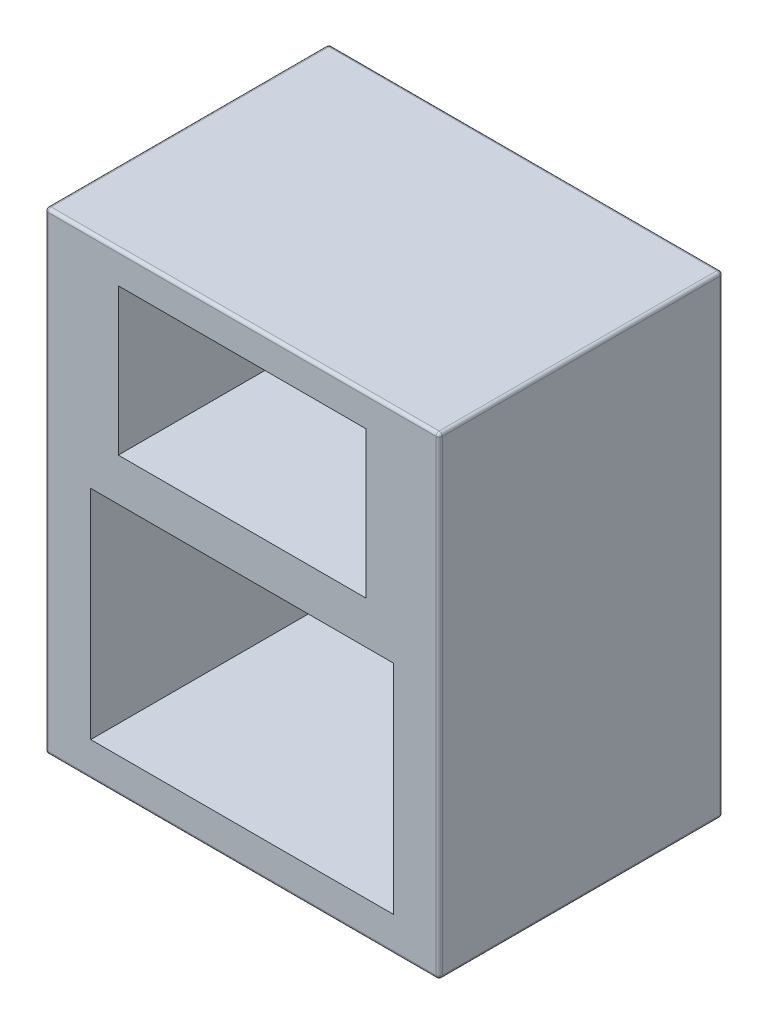
ISO-10303-21;
HEADER;
FILE_DESCRIPTION(('STEP AP214'),'2;1');
FILE_NAME('part.step','',(''),(''),'','','');
FILE_SCHEMA(('AUTOMOTIVE_DESIGN { 1 0 10303 214 1 1 1 1 }'));
ENDSEC;
DATA;
#1=APPLICATION_CONTEXT('core data for automotive mechanical design processes');
#2=APPLICATION_PROTOCOL_DEFINITION('international standard','automotive_design',2000,#1);
#3=PRODUCT_CONTEXT('',#1,'mechanical');
#4=PRODUCT('Part','Part','',(#3));
#5=PRODUCT_RELATED_PRODUCT_CATEGORY('part','',(#4));
#6=PRODUCT_DEFINITION_FORMATION('','',#4);
#7=PRODUCT_DEFINITION_CONTEXT('part definition',#1,'design');
#8=PRODUCT_DEFINITION('design','',#6,#7);
#9=PRODUCT_DEFINITION_SHAPE('','',#8);
#10=(LENGTH_UNIT() NAMED_UNIT(*) SI_UNIT(.MILLI.,.METRE.));
#11=(NAMED_UNIT(*) PLANE_ANGLE_UNIT() SI_UNIT($,.RADIAN.));
#12=(NAMED_UNIT(*) SI_UNIT($,.STERADIAN.) SOLID_ANGLE_UNIT());
#13=UNCERTAINTY_MEASURE_WITH_UNIT(LENGTH_MEASURE(1.E-05),#10,'distance_accuracy_value','');
#14=(GEOMETRIC_REPRESENTATION_CONTEXT(3) GLOBAL_UNCERTAINTY_ASSIGNED_CONTEXT((#13)) GLOBAL_UNIT_ASSIGNED_CONTEXT((#10,
#11,#12)) REPRESENTATION_CONTEXT('',''));
#15=CARTESIAN_POINT('',(0.,0.,0.));
#16=DIRECTION('',(0.,0.,1.));
#17=DIRECTION('',(1.,0.,0.));
#18=AXIS2_PLACEMENT_3D('',#15,#16,#17);
#19=CARTESIAN_POINT('',(0.,0.,180.));
#20=DIRECTION('',(1.,0.,0.));
#21=DIRECTION('',(0.,0.,-1.));
#22=AXIS2_PLACEMENT_3D('',#19,#20,#21);
#23=PLANE('',#22);
#24=DIRECTION('',(0.,-1.,0.));
#25=VECTOR('',#24,1.);
#26=CARTESIAN_POINT('',(0.,0.,2.));
#27=LINE('',#26,#25);
#28=CARTESIAN_POINT('',(0.,298.,2.));
#29=VERTEX_POINT('',#28);
#30=CARTESIAN_POINT('',(0.,2.,2.));
#31=VERTEX_POINT('',#30);
#32=EDGE_CURVE('E255',#29,#31,#27,.T.);
#33=ORIENTED_EDGE('',*,*,#32,.T.);
#34=DIRECTION('',(0.,0.,-1.));
#35=VECTOR('',#34,1.);
#36=CARTESIAN_POINT('',(0.,2.,180.));
#37=LINE('',#36,#35);
#38=CARTESIAN_POINT('',(0.,2.,178.));
#39=VERTEX_POINT('',#38);
#40=EDGE_CURVE('E257',#31,#39,#37,.F.);
#41=ORIENTED_EDGE('',*,*,#40,.T.);
#42=DIRECTION('',(0.,-1.,0.));
#43=VECTOR('',#42,1.);
#44=CARTESIAN_POINT('',(0.,0.,178.));
#45=LINE('',#44,#43);
#46=CARTESIAN_POINT('',(0.,298.,178.));
#47=VERTEX_POINT('',#46);
#48=EDGE_CURVE('E251',#39,#47,#45,.F.);
#49=ORIENTED_EDGE('',*,*,#48,.T.);
#50=DIRECTION('',(0.,0.,-1.));
#51=VECTOR('',#50,1.);
#52=CARTESIAN_POINT('',(0.,298.,180.));
#53=LINE('',#52,#51);
#54=EDGE_CURVE('E253',#47,#29,#53,.T.);
#55=ORIENTED_EDGE('',*,*,#54,.T.);
#56=EDGE_LOOP('',(#33,#41,#49,#55));
#57=FACE_BOUND('',#56,.T.);
#58=ADVANCED_FACE('F36',(#57),#23,.F.);
#59=CARTESIAN_POINT('',(0.,0.,180.));
#60=DIRECTION('',(0.,1.,0.));
#61=DIRECTION('',(0.,0.,1.));
#62=AXIS2_PLACEMENT_3D('',#59,#60,#61);
#63=PLANE('',#62);
#64=DIRECTION('',(1.,0.,0.));
#65=VECTOR('',#64,1.);
#66=CARTESIAN_POINT('',(0.,0.,178.));
#67=LINE('',#66,#65);
#68=CARTESIAN_POINT('',(248.,0.,178.));
#69=VERTEX_POINT('',#68);
#70=CARTESIAN_POINT('',(2.,0.,178.));
#71=VERTEX_POINT('',#70);
#72=EDGE_CURVE('E242',#69,#71,#67,.F.);
#73=ORIENTED_EDGE('',*,*,#72,.T.);
#74=DIRECTION('',(0.,0.,-1.));
#75=VECTOR('',#74,1.);
#76=CARTESIAN_POINT('',(2.,0.,180.));
#77=LINE('',#76,#75);
#78=CARTESIAN_POINT('',(2.,0.,2.));
#79=VERTEX_POINT('',#78);
#80=EDGE_CURVE('E248',#71,#79,#77,.T.);
#81=ORIENTED_EDGE('',*,*,#80,.T.);
#82=DIRECTION('',(1.,0.,0.));
#83=VECTOR('',#82,1.);
#84=CARTESIAN_POINT('',(250.,0.,2.));
#85=LINE('',#84,#83);
#86=CARTESIAN_POINT('',(248.,0.,2.));
#87=VERTEX_POINT('',#86);
#88=EDGE_CURVE('E246',#79,#87,#85,.T.);
#89=ORIENTED_EDGE('',*,*,#88,.T.);
#90=DIRECTION('',(0.,0.,-1.));
#91=VECTOR('',#90,1.);
#92=CARTESIAN_POINT('',(248.,0.,180.));
#93=LINE('',#92,#91);
#94=EDGE_CURVE('E244',#87,#69,#93,.F.);
#95=ORIENTED_EDGE('',*,*,#94,.T.);
#96=EDGE_LOOP('',(#73,#81,#89,#95));
#97=FACE_BOUND('',#96,.T.);
#98=ADVANCED_FACE('F445',(#97),#63,.F.);
#99=CARTESIAN_POINT('',(250.,0.,180.));
#100=DIRECTION('',(-1.,0.,0.));
#101=DIRECTION('',(0.,0.,1.));
#102=AXIS2_PLACEMENT_3D('',#99,#100,#101);
#103=PLANE('',#102);
#104=DIRECTION('',(0.,1.,0.));
#105=VECTOR('',#104,1.);
#106=CARTESIAN_POINT('',(250.,0.,178.));
#107=LINE('',#106,#105);
#108=CARTESIAN_POINT('',(250.,298.,178.));
#109=VERTEX_POINT('',#108);
#110=CARTESIAN_POINT('',(250.,2.,178.));
#111=VERTEX_POINT('',#110);
#112=EDGE_CURVE('E269',#109,#111,#107,.F.);
#113=ORIENTED_EDGE('',*,*,#112,.T.);
#114=DIRECTION('',(0.,0.,-1.));
#115=VECTOR('',#114,1.);
#116=CARTESIAN_POINT('',(250.,2.,180.));
#117=LINE('',#116,#115);
#118=CARTESIAN_POINT('',(250.,2.,2.));
#119=VERTEX_POINT('',#118);
#120=EDGE_CURVE('E275',#111,#119,#117,.T.);
#121=ORIENTED_EDGE('',*,*,#120,.T.);
#122=DIRECTION('',(0.,1.,0.));
#123=VECTOR('',#122,1.);
#124=CARTESIAN_POINT('',(250.,300.,2.));
#125=LINE('',#124,#123);
#126=CARTESIAN_POINT('',(250.,298.,2.));
#127=VERTEX_POINT('',#126);
#128=EDGE_CURVE('E273',#119,#127,#125,.T.);
#129=ORIENTED_EDGE('',*,*,#128,.T.);
#130=DIRECTION('',(0.,0.,-1.));
#131=VECTOR('',#130,1.);
#132=CARTESIAN_POINT('',(250.,298.,180.));
#133=LINE('',#132,#131);
#134=EDGE_CURVE('E271',#127,#109,#133,.F.);
#135=ORIENTED_EDGE('',*,*,#134,.T.);
#136=EDGE_LOOP('',(#113,#121,#129,#135));
#137=FACE_BOUND('',#136,.T.);
#138=ADVANCED_FACE('F383',(#137),#103,.F.);
#139=CARTESIAN_POINT('',(0.,300.,180.));
#140=DIRECTION('',(0.,-1.,0.));
#141=DIRECTION('',(0.,0.,-1.));
#142=AXIS2_PLACEMENT_3D('',#139,#140,#141);
#143=PLANE('',#142);
#144=DIRECTION('',(0.,0.,-1.));
#145=VECTOR('',#144,1.);
#146=CARTESIAN_POINT('',(248.,300.,180.));
#147=LINE('',#146,#145);
#148=CARTESIAN_POINT('',(248.,300.,178.));
#149=VERTEX_POINT('',#148);
#150=CARTESIAN_POINT('',(248.,300.,2.));
#151=VERTEX_POINT('',#150);
#152=EDGE_CURVE('E282',#149,#151,#147,.T.);
#153=ORIENTED_EDGE('',*,*,#152,.T.);
#154=DIRECTION('',(-1.,0.,0.));
#155=VECTOR('',#154,1.);
#156=CARTESIAN_POINT('',(0.,300.,2.));
#157=LINE('',#156,#155);
#158=CARTESIAN_POINT('',(2.,300.,2.));
#159=VERTEX_POINT('',#158);
#160=EDGE_CURVE('E285',#151,#159,#157,.T.);
#161=ORIENTED_EDGE('',*,*,#160,.T.);
#162=DIRECTION('',(0.,0.,-1.));
#163=VECTOR('',#162,1.);
#164=CARTESIAN_POINT('',(2.,300.,180.));
#165=LINE('',#164,#163);
#166=CARTESIAN_POINT('',(2.,300.,178.));
#167=VERTEX_POINT('',#166);
#168=EDGE_CURVE('E280',#159,#167,#165,.F.);
#169=ORIENTED_EDGE('',*,*,#168,.T.);
#170=DIRECTION('',(-1.,0.,0.));
#171=VECTOR('',#170,1.);
#172=CARTESIAN_POINT('',(0.,300.,178.));
#173=LINE('',#172,#171);
#174=EDGE_CURVE('E278',#167,#149,#173,.F.);
#175=ORIENTED_EDGE('',*,*,#174,.T.);
#176=EDGE_LOOP('',(#153,#161,#169,#175));
#177=FACE_BOUND('',#176,.T.);
#178=ADVANCED_FACE('F398',(#177),#143,.F.);
#179=CARTESIAN_POINT('',(0.,0.,180.));
#180=DIRECTION('',(0.,0.,-1.));
#181=DIRECTION('',(-1.,0.,0.));
#182=AXIS2_PLACEMENT_3D('',#179,#180,#181);
#183=PLANE('',#182);
#184=DIRECTION('',(0.,-1.,0.));
#185=VECTOR('',#184,1.);
#186=CARTESIAN_POINT('',(29.,160.,180.));
#187=LINE('',#186,#185);
#188=CARTESIAN_POINT('',(29.,160.,180.));
#189=VERTEX_POINT('',#188);
#190=CARTESIAN_POINT('',(29.,21.9999999999999,180.));
#191=VERTEX_POINT('',#190);
#192=EDGE_CURVE('E194',#189,#191,#187,.T.);
#193=ORIENTED_EDGE('',*,*,#192,.F.);
#194=DIRECTION('',(-1.,0.,0.));
#195=VECTOR('',#194,1.);
#196=CARTESIAN_POINT('',(29.,160.,180.));
#197=LINE('',#196,#195);
#198=CARTESIAN_POINT('',(221.,160.,180.));
#199=VERTEX_POINT('',#198);
#200=EDGE_CURVE('E53',#199,#189,#197,.T.);
#201=ORIENTED_EDGE('',*,*,#200,.F.);
#202=DIRECTION('',(0.,1.,0.));
#203=VECTOR('',#202,1.);
#204=CARTESIAN_POINT('',(221.,160.,180.));
#205=LINE('',#204,#203);
#206=CARTESIAN_POINT('',(221.,21.9999999999999,180.));
#207=VERTEX_POINT('',#206);
#208=EDGE_CURVE('E187',#207,#199,#205,.T.);
#209=ORIENTED_EDGE('',*,*,#208,.F.);
#210=DIRECTION('',(1.,0.,0.));
#211=VECTOR('',#210,1.);
#212=CARTESIAN_POINT('',(29.,21.9999999999999,180.));
#213=LINE('',#212,#211);
#214=EDGE_CURVE('E201',#191,#207,#213,.T.);
#215=ORIENTED_EDGE('',*,*,#214,.F.);
#216=EDGE_LOOP('',(#193,#201,#209,#215));
#217=FACE_BOUND('',#216,.T.);
#218=DIRECTION('',(0.,-1.,0.));
#219=VECTOR('',#218,1.);
#220=CARTESIAN_POINT('',(46.5,280.,180.));
#221=LINE('',#220,#219);
#222=CARTESIAN_POINT('',(46.5,280.,180.));
#223=VERTEX_POINT('',#222);
#224=CARTESIAN_POINT('',(46.5,187.,180.));
#225=VERTEX_POINT('',#224);
#226=EDGE_CURVE('E220',#223,#225,#221,.T.);
#227=ORIENTED_EDGE('',*,*,#226,.F.);
#228=DIRECTION('',(-1.,0.,0.));
#229=VECTOR('',#228,1.);
#230=CARTESIAN_POINT('',(46.5,280.,180.));
#231=LINE('',#230,#229);
#232=CARTESIAN_POINT('',(203.5,280.,180.));
#233=VERTEX_POINT('',#232);
#234=EDGE_CURVE('E218',#233,#223,#231,.T.);
#235=ORIENTED_EDGE('',*,*,#234,.F.);
#236=DIRECTION('',(0.,1.,0.));
#237=VECTOR('',#236,1.);
#238=CARTESIAN_POINT('',(203.5,280.,180.));
#239=LINE('',#238,#237);
#240=CARTESIAN_POINT('',(203.5,187.,180.));
#241=VERTEX_POINT('',#240);
#242=EDGE_CURVE('E226',#241,#233,#239,.T.);
#243=ORIENTED_EDGE('',*,*,#242,.F.);
#244=DIRECTION('',(1.,0.,0.));
#245=VECTOR('',#244,1.);
#246=CARTESIAN_POINT('',(46.5,187.,180.));
#247=LINE('',#246,#245);
#248=EDGE_CURVE('E223',#225,#241,#247,.T.);
#249=ORIENTED_EDGE('',*,*,#248,.F.);
#250=EDGE_LOOP('',(#227,#235,#243,#249));
#251=FACE_BOUND('',#250,.T.);
#252=DIRECTION('',(0.,1.,0.));
#253=VECTOR('',#252,1.);
#254=CARTESIAN_POINT('',(248.,0.,180.));
#255=LINE('',#254,#253);
#256=CARTESIAN_POINT('',(248.,2.,180.));
#257=VERTEX_POINT('',#256);
#258=CARTESIAN_POINT('',(248.,298.,180.));
#259=VERTEX_POINT('',#258);
#260=EDGE_CURVE('E45',#257,#259,#255,.T.);
#261=ORIENTED_EDGE('',*,*,#260,.T.);
#262=DIRECTION('',(-1.,0.,0.));
#263=VECTOR('',#262,1.);
#264=CARTESIAN_POINT('',(0.,298.,180.));
#265=LINE('',#264,#263);
#266=CARTESIAN_POINT('',(2.,298.,180.));
#267=VERTEX_POINT('',#266);
#268=EDGE_CURVE('E11',#259,#267,#265,.T.);
#269=ORIENTED_EDGE('',*,*,#268,.T.);
#270=DIRECTION('',(0.,-1.,0.));
#271=VECTOR('',#270,1.);
#272=CARTESIAN_POINT('',(2.,0.,180.));
#273=LINE('',#272,#271);
#274=CARTESIAN_POINT('',(2.,2.,180.));
#275=VERTEX_POINT('',#274);
#276=EDGE_CURVE('E287',#267,#275,#273,.T.);
#277=ORIENTED_EDGE('',*,*,#276,.T.);
#278=DIRECTION('',(1.,0.,0.));
#279=VECTOR('',#278,1.);
#280=CARTESIAN_POINT('',(0.,2.,180.));
#281=LINE('',#280,#279);
#282=EDGE_CURVE('E289',#275,#257,#281,.T.);
#283=ORIENTED_EDGE('',*,*,#282,.T.);
#284=EDGE_LOOP('',(#261,#269,#277,#283));
#285=FACE_BOUND('',#284,.T.);
#286=ADVANCED_FACE('F375',(#217,#251,#285),#183,.F.);
#287=CARTESIAN_POINT('',(0.,0.,0.));
#288=DIRECTION('',(0.,0.,-1.));
#289=DIRECTION('',(-1.,0.,0.));
#290=AXIS2_PLACEMENT_3D('',#287,#288,#289);
#291=PLANE('',#290);
#292=DIRECTION('',(-1.,0.,0.));
#293=VECTOR('',#292,1.);
#294=CARTESIAN_POINT('',(29.,160.,0.));
#295=LINE('',#294,#293);
#296=CARTESIAN_POINT('',(221.,160.,0.));
#297=VERTEX_POINT('',#296);
#298=CARTESIAN_POINT('',(29.,160.,0.));
#299=VERTEX_POINT('',#298);
#300=EDGE_CURVE('E185',#297,#299,#295,.T.);
#301=ORIENTED_EDGE('',*,*,#300,.T.);
#302=DIRECTION('',(0.,-1.,0.));
#303=VECTOR('',#302,1.);
#304=CARTESIAN_POINT('',(29.,160.,0.));
#305=LINE('',#304,#303);
#306=CARTESIAN_POINT('',(29.,21.9999999999999,0.));
#307=VERTEX_POINT('',#306);
#308=EDGE_CURVE('E174',#299,#307,#305,.T.);
#309=ORIENTED_EDGE('',*,*,#308,.T.);
#310=DIRECTION('',(1.,0.,0.));
#311=VECTOR('',#310,1.);
#312=CARTESIAN_POINT('',(29.,21.9999999999999,0.));
#313=LINE('',#312,#311);
#314=CARTESIAN_POINT('',(221.,21.9999999999999,0.));
#315=VERTEX_POINT('',#314);
#316=EDGE_CURVE('E196',#307,#315,#313,.T.);
#317=ORIENTED_EDGE('',*,*,#316,.T.);
#318=DIRECTION('',(0.,1.,0.));
#319=VECTOR('',#318,1.);
#320=CARTESIAN_POINT('',(221.,160.,0.));
#321=LINE('',#320,#319);
#322=EDGE_CURVE('E192',#315,#297,#321,.T.);
#323=ORIENTED_EDGE('',*,*,#322,.T.);
#324=EDGE_LOOP('',(#301,#309,#317,#323));
#325=FACE_BOUND('',#324,.T.);
#326=DIRECTION('',(-1.,0.,0.));
#327=VECTOR('',#326,1.);
#328=CARTESIAN_POINT('',(46.5,280.,0.));
#329=LINE('',#328,#327);
#330=CARTESIAN_POINT('',(203.5,280.,0.));
#331=VERTEX_POINT('',#330);
#332=CARTESIAN_POINT('',(46.5,280.,0.));
#333=VERTEX_POINT('',#332);
#334=EDGE_CURVE('E215',#331,#333,#329,.T.);
#335=ORIENTED_EDGE('',*,*,#334,.T.);
#336=DIRECTION('',(0.,-1.,0.));
#337=VECTOR('',#336,1.);
#338=CARTESIAN_POINT('',(46.5,280.,0.));
#339=LINE('',#338,#337);
#340=CARTESIAN_POINT('',(46.5,187.,0.));
#341=VERTEX_POINT('',#340);
#342=EDGE_CURVE('E232',#333,#341,#339,.T.);
#343=ORIENTED_EDGE('',*,*,#342,.T.);
#344=DIRECTION('',(1.,0.,0.));
#345=VECTOR('',#344,1.);
#346=CARTESIAN_POINT('',(46.5,187.,0.));
#347=LINE('',#346,#345);
#348=CARTESIAN_POINT('',(203.5,187.,0.));
#349=VERTEX_POINT('',#348);
#350=EDGE_CURVE('E181',#341,#349,#347,.T.);
#351=ORIENTED_EDGE('',*,*,#350,.T.);
#352=DIRECTION('',(0.,1.,0.));
#353=VECTOR('',#352,1.);
#354=CARTESIAN_POINT('',(203.5,280.,0.));
#355=LINE('',#354,#353);
#356=EDGE_CURVE('E212',#349,#331,#355,.T.);
#357=ORIENTED_EDGE('',*,*,#356,.T.);
#358=EDGE_LOOP('',(#335,#343,#351,#357));
#359=FACE_BOUND('',#358,.T.);
#360=DIRECTION('',(0.,1.,0.));
#361=VECTOR('',#360,1.);
#362=CARTESIAN_POINT('',(248.,0.,0.));
#363=LINE('',#362,#361);
#364=CARTESIAN_POINT('',(248.,298.,0.));
#365=VERTEX_POINT('',#364);
#366=CARTESIAN_POINT('',(248.,2.,0.));
#367=VERTEX_POINT('',#366);
#368=EDGE_CURVE('E262',#365,#367,#363,.F.);
#369=ORIENTED_EDGE('',*,*,#368,.T.);
#370=DIRECTION('',(1.,0.,0.));
#371=VECTOR('',#370,1.);
#372=CARTESIAN_POINT('',(0.,2.,0.));
#373=LINE('',#372,#371);
#374=CARTESIAN_POINT('',(2.,2.,0.));
#375=VERTEX_POINT('',#374);
#376=EDGE_CURVE('E266',#367,#375,#373,.F.);
#377=ORIENTED_EDGE('',*,*,#376,.T.);
#378=DIRECTION('',(0.,-1.,0.));
#379=VECTOR('',#378,1.);
#380=CARTESIAN_POINT('',(2.,300.,0.));
#381=LINE('',#380,#379);
#382=CARTESIAN_POINT('',(2.,298.,0.));
#383=VERTEX_POINT('',#382);
#384=EDGE_CURVE('E264',#375,#383,#381,.F.);
#385=ORIENTED_EDGE('',*,*,#384,.T.);
#386=DIRECTION('',(-1.,0.,0.));
#387=VECTOR('',#386,1.);
#388=CARTESIAN_POINT('',(250.,298.,0.));
#389=LINE('',#388,#387);
#390=EDGE_CURVE('E260',#383,#365,#389,.F.);
#391=ORIENTED_EDGE('',*,*,#390,.T.);
#392=EDGE_LOOP('',(#369,#377,#385,#391));
#393=FACE_BOUND('',#392,.T.);
#394=ADVANCED_FACE('F190',(#325,#359,#393),#291,.T.);
#395=CARTESIAN_POINT('',(248.,298.,180.));
#396=DIRECTION('',(0.,0.,-1.));
#397=DIRECTION('',(-1.,0.,0.));
#398=AXIS2_PLACEMENT_3D('',#395,#396,#397);
#399=CYLINDRICAL_SURFACE('',#398,2.);
#400=CARTESIAN_POINT('',(248.,298.,178.));
#401=DIRECTION('',(0.,0.,1.));
#402=DIRECTION('',(1.,0.,0.));
#403=AXIS2_PLACEMENT_3D('',#400,#401,#402);
#404=CIRCLE('',#403,2.);
#405=EDGE_CURVE('E40',#109,#149,#404,.T.);
#406=ORIENTED_EDGE('',*,*,#405,.F.);
#407=ORIENTED_EDGE('',*,*,#134,.F.);
#408=CARTESIAN_POINT('',(248.,298.,2.));
#409=DIRECTION('',(0.,0.,-1.));
#410=DIRECTION('',(-1.,0.,0.));
#411=AXIS2_PLACEMENT_3D('',#408,#409,#410);
#412=CIRCLE('',#411,2.);
#413=EDGE_CURVE('E352',#151,#127,#412,.T.);
#414=ORIENTED_EDGE('',*,*,#413,.F.);
#415=ORIENTED_EDGE('',*,*,#152,.F.);
#416=EDGE_LOOP('',(#406,#407,#414,#415));
#417=FACE_BOUND('',#416,.T.);
#418=ADVANCED_FACE('F38',(#417),#399,.T.);
#419=CARTESIAN_POINT('',(248.,298.,178.));
#420=DIRECTION('',(0.,0.,1.));
#421=DIRECTION('',(1.,0.,0.));
#422=AXIS2_PLACEMENT_3D('',#419,#420,#421);
#423=SPHERICAL_SURFACE('',#422,2.);
#424=CARTESIAN_POINT('',(248.,298.,178.));
#425=DIRECTION('',(0.,1.,0.));
#426=DIRECTION('',(0.,0.,1.));
#427=AXIS2_PLACEMENT_3D('',#424,#425,#426);
#428=CIRCLE('',#427,2.);
#429=EDGE_CURVE('E347',#109,#259,#428,.F.);
#430=ORIENTED_EDGE('',*,*,#429,.F.);
#431=ORIENTED_EDGE('',*,*,#405,.T.);
#432=CARTESIAN_POINT('',(248.,298.,178.));
#433=DIRECTION('',(1.,0.,0.));
#434=DIRECTION('',(0.,0.,-1.));
#435=AXIS2_PLACEMENT_3D('',#432,#433,#434);
#436=CIRCLE('',#435,2.);
#437=EDGE_CURVE('E350',#259,#149,#436,.F.);
#438=ORIENTED_EDGE('',*,*,#437,.F.);
#439=EDGE_LOOP('',(#430,#431,#438));
#440=FACE_BOUND('',#439,.T.);
#441=ADVANCED_FACE('F363',(#440),#423,.T.);
#442=CARTESIAN_POINT('',(248.,298.,2.));
#443=DIRECTION('',(0.,0.,1.));
#444=DIRECTION('',(1.,0.,0.));
#445=AXIS2_PLACEMENT_3D('',#442,#443,#444);
#446=SPHERICAL_SURFACE('',#445,2.);
#447=CARTESIAN_POINT('',(248.,298.,2.));
#448=DIRECTION('',(1.,0.,0.));
#449=DIRECTION('',(0.,0.,-1.));
#450=AXIS2_PLACEMENT_3D('',#447,#448,#449);
#451=CIRCLE('',#450,2.);
#452=EDGE_CURVE('E341',#151,#365,#451,.F.);
#453=ORIENTED_EDGE('',*,*,#452,.F.);
#454=ORIENTED_EDGE('',*,*,#413,.T.);
#455=CARTESIAN_POINT('',(248.,298.,2.));
#456=DIRECTION('',(0.,1.,0.));
#457=DIRECTION('',(0.,0.,1.));
#458=AXIS2_PLACEMENT_3D('',#455,#456,#457);
#459=CIRCLE('',#458,2.);
#460=EDGE_CURVE('E344',#365,#127,#459,.F.);
#461=ORIENTED_EDGE('',*,*,#460,.F.);
#462=EDGE_LOOP('',(#453,#454,#461));
#463=FACE_BOUND('',#462,.T.);
#464=ADVANCED_FACE('F726',(#463),#446,.T.);
#465=CARTESIAN_POINT('',(0.,298.,178.));
#466=DIRECTION('',(-1.,0.,0.));
#467=DIRECTION('',(0.,0.,1.));
#468=AXIS2_PLACEMENT_3D('',#465,#466,#467);
#469=CYLINDRICAL_SURFACE('',#468,2.);
#470=ORIENTED_EDGE('',*,*,#437,.T.);
#471=ORIENTED_EDGE('',*,*,#174,.F.);
#472=CARTESIAN_POINT('',(2.,298.,178.));
#473=DIRECTION('',(-1.,0.,0.));
#474=DIRECTION('',(0.,0.,1.));
#475=AXIS2_PLACEMENT_3D('',#472,#473,#474);
#476=CIRCLE('',#475,2.);
#477=EDGE_CURVE('E335',#267,#167,#476,.T.);
#478=ORIENTED_EDGE('',*,*,#477,.F.);
#479=ORIENTED_EDGE('',*,*,#268,.F.);
#480=EDGE_LOOP('',(#470,#471,#478,#479));
#481=FACE_BOUND('',#480,.T.);
#482=ADVANCED_FACE('F371',(#481),#469,.T.);
#483=CARTESIAN_POINT('',(248.,0.,178.));
#484=DIRECTION('',(0.,1.,0.));
#485=DIRECTION('',(0.,0.,1.));
#486=AXIS2_PLACEMENT_3D('',#483,#484,#485);
#487=CYLINDRICAL_SURFACE('',#486,2.);
#488=ORIENTED_EDGE('',*,*,#429,.T.);
#489=ORIENTED_EDGE('',*,*,#260,.F.);
#490=CARTESIAN_POINT('',(248.,2.,178.));
#491=DIRECTION('',(0.,-1.,0.));
#492=DIRECTION('',(0.,0.,-1.));
#493=AXIS2_PLACEMENT_3D('',#490,#491,#492);
#494=CIRCLE('',#493,2.);
#495=EDGE_CURVE('E332',#111,#257,#494,.T.);
#496=ORIENTED_EDGE('',*,*,#495,.F.);
#497=ORIENTED_EDGE('',*,*,#112,.F.);
#498=EDGE_LOOP('',(#488,#489,#496,#497));
#499=FACE_BOUND('',#498,.T.);
#500=ADVANCED_FACE('F380',(#499),#487,.T.);
#501=CARTESIAN_POINT('',(248.,2.,180.));
#502=DIRECTION('',(0.,0.,-1.));
#503=DIRECTION('',(-1.,0.,0.));
#504=AXIS2_PLACEMENT_3D('',#501,#502,#503);
#505=CYLINDRICAL_SURFACE('',#504,2.);
#506=CARTESIAN_POINT('',(248.,2.,2.));
#507=DIRECTION('',(0.,0.,-1.));
#508=DIRECTION('',(-1.,0.,0.));
#509=AXIS2_PLACEMENT_3D('',#506,#507,#508);
#510=CIRCLE('',#509,2.);
#511=EDGE_CURVE('E326',#119,#87,#510,.T.);
#512=ORIENTED_EDGE('',*,*,#511,.F.);
#513=ORIENTED_EDGE('',*,*,#120,.F.);
#514=CARTESIAN_POINT('',(248.,2.,178.));
#515=DIRECTION('',(0.,0.,1.));
#516=DIRECTION('',(1.,0.,0.));
#517=AXIS2_PLACEMENT_3D('',#514,#515,#516);
#518=CIRCLE('',#517,2.);
#519=EDGE_CURVE('E329',#69,#111,#518,.T.);
#520=ORIENTED_EDGE('',*,*,#519,.F.);
#521=ORIENTED_EDGE('',*,*,#94,.F.);
#522=EDGE_LOOP('',(#512,#513,#520,#521));
#523=FACE_BOUND('',#522,.T.);
#524=ADVANCED_FACE('F387',(#523),#505,.T.);
#525=CARTESIAN_POINT('',(248.,0.,2.));
#526=DIRECTION('',(0.,-1.,0.));
#527=DIRECTION('',(0.,0.,-1.));
#528=AXIS2_PLACEMENT_3D('',#525,#526,#527);
#529=CYLINDRICAL_SURFACE('',#528,2.);
#530=ORIENTED_EDGE('',*,*,#460,.T.);
#531=ORIENTED_EDGE('',*,*,#128,.F.);
#532=CARTESIAN_POINT('',(248.,2.,2.));
#533=DIRECTION('',(0.,-1.,0.));
#534=DIRECTION('',(1.,0.,0.));
#535=AXIS2_PLACEMENT_3D('',#532,#533,#534);
#536=CIRCLE('',#535,2.);
#537=EDGE_CURVE('E324',#367,#119,#536,.T.);
#538=ORIENTED_EDGE('',*,*,#537,.F.);
#539=ORIENTED_EDGE('',*,*,#368,.F.);
#540=EDGE_LOOP('',(#530,#531,#538,#539));
#541=FACE_BOUND('',#540,.T.);
#542=ADVANCED_FACE('F395',(#541),#529,.T.);
#543=CARTESIAN_POINT('',(0.,298.,2.));
#544=DIRECTION('',(1.,0.,0.));
#545=DIRECTION('',(0.,0.,-1.));
#546=AXIS2_PLACEMENT_3D('',#543,#544,#545);
#547=CYLINDRICAL_SURFACE('',#546,2.);
#548=ORIENTED_EDGE('',*,*,#452,.T.);
#549=ORIENTED_EDGE('',*,*,#390,.F.);
#550=CARTESIAN_POINT('',(2.,298.,2.));
#551=DIRECTION('',(-1.,0.,0.));
#552=DIRECTION('',(0.,0.,1.));
#553=AXIS2_PLACEMENT_3D('',#550,#551,#552);
#554=CIRCLE('',#553,2.);
#555=EDGE_CURVE('E321',#159,#383,#554,.T.);
#556=ORIENTED_EDGE('',*,*,#555,.F.);
#557=ORIENTED_EDGE('',*,*,#160,.F.);
#558=EDGE_LOOP('',(#548,#549,#556,#557));
#559=FACE_BOUND('',#558,.T.);
#560=ADVANCED_FACE('F408',(#559),#547,.T.);
#561=CARTESIAN_POINT('',(2.,298.,180.));
#562=DIRECTION('',(0.,0.,-1.));
#563=DIRECTION('',(-1.,0.,0.));
#564=AXIS2_PLACEMENT_3D('',#561,#562,#563);
#565=CYLINDRICAL_SURFACE('',#564,2.);
#566=CARTESIAN_POINT('',(2.,298.,178.));
#567=DIRECTION('',(0.,0.,1.));
#568=DIRECTION('',(1.,0.,0.));
#569=AXIS2_PLACEMENT_3D('',#566,#567,#568);
#570=CIRCLE('',#569,2.);
#571=EDGE_CURVE('E338',#167,#47,#570,.T.);
#572=ORIENTED_EDGE('',*,*,#571,.F.);
#573=ORIENTED_EDGE('',*,*,#168,.F.);
#574=CARTESIAN_POINT('',(2.,298.,2.));
#575=DIRECTION('',(0.,0.,-1.));
#576=DIRECTION('',(-1.,0.,0.));
#577=AXIS2_PLACEMENT_3D('',#574,#575,#576);
#578=CIRCLE('',#577,2.);
#579=EDGE_CURVE('E318',#29,#159,#578,.T.);
#580=ORIENTED_EDGE('',*,*,#579,.F.);
#581=ORIENTED_EDGE('',*,*,#54,.F.);
#582=EDGE_LOOP('',(#572,#573,#580,#581));
#583=FACE_BOUND('',#582,.T.);
#584=ADVANCED_FACE('F403',(#583),#565,.T.);
#585=CARTESIAN_POINT('',(2.,298.,178.));
#586=DIRECTION('',(0.,0.,1.));
#587=DIRECTION('',(1.,0.,0.));
#588=AXIS2_PLACEMENT_3D('',#585,#586,#587);
#589=SPHERICAL_SURFACE('',#588,2.);
#590=ORIENTED_EDGE('',*,*,#477,.T.);
#591=ORIENTED_EDGE('',*,*,#571,.T.);
#592=CARTESIAN_POINT('',(2.,298.,178.));
#593=DIRECTION('',(0.,1.,0.));
#594=DIRECTION('',(0.,0.,1.));
#595=AXIS2_PLACEMENT_3D('',#592,#593,#594);
#596=CIRCLE('',#595,2.);
#597=EDGE_CURVE('E315',#267,#47,#596,.F.);
#598=ORIENTED_EDGE('',*,*,#597,.F.);
#599=EDGE_LOOP('',(#590,#591,#598));
#600=FACE_BOUND('',#599,.T.);
#601=ADVANCED_FACE('F421',(#600),#589,.T.);
#602=CARTESIAN_POINT('',(248.,2.,178.));
#603=DIRECTION('',(0.,0.,1.));
#604=DIRECTION('',(1.,0.,0.));
#605=AXIS2_PLACEMENT_3D('',#602,#603,#604);
#606=SPHERICAL_SURFACE('',#605,2.);
#607=ORIENTED_EDGE('',*,*,#519,.T.);
#608=ORIENTED_EDGE('',*,*,#495,.T.);
#609=CARTESIAN_POINT('',(248.,2.,178.));
#610=DIRECTION('',(1.,0.,0.));
#611=DIRECTION('',(0.,0.,-1.));
#612=AXIS2_PLACEMENT_3D('',#609,#610,#611);
#613=CIRCLE('',#612,2.);
#614=EDGE_CURVE('E312',#69,#257,#613,.F.);
#615=ORIENTED_EDGE('',*,*,#614,.F.);
#616=EDGE_LOOP('',(#607,#608,#615));
#617=FACE_BOUND('',#616,.T.);
#618=ADVANCED_FACE('F434',(#617),#606,.T.);
#619=CARTESIAN_POINT('',(248.,2.,2.));
#620=DIRECTION('',(0.,0.,1.));
#621=DIRECTION('',(1.,0.,0.));
#622=AXIS2_PLACEMENT_3D('',#619,#620,#621);
#623=SPHERICAL_SURFACE('',#622,2.);
#624=ORIENTED_EDGE('',*,*,#537,.T.);
#625=ORIENTED_EDGE('',*,*,#511,.T.);
#626=CARTESIAN_POINT('',(248.,2.,2.));
#627=DIRECTION('',(1.,0.,0.));
#628=DIRECTION('',(0.,0.,-1.));
#629=AXIS2_PLACEMENT_3D('',#626,#627,#628);
#630=CIRCLE('',#629,2.);
#631=EDGE_CURVE('E309',#367,#87,#630,.F.);
#632=ORIENTED_EDGE('',*,*,#631,.F.);
#633=EDGE_LOOP('',(#624,#625,#632));
#634=FACE_BOUND('',#633,.T.);
#635=ADVANCED_FACE('F436',(#634),#623,.T.);
#636=CARTESIAN_POINT('',(2.,298.,2.));
#637=DIRECTION('',(0.,0.,1.));
#638=DIRECTION('',(1.,0.,0.));
#639=AXIS2_PLACEMENT_3D('',#636,#637,#638);
#640=SPHERICAL_SURFACE('',#639,2.);
#641=ORIENTED_EDGE('',*,*,#579,.T.);
#642=ORIENTED_EDGE('',*,*,#555,.T.);
#643=CARTESIAN_POINT('',(2.,298.,2.));
#644=DIRECTION('',(0.,1.,0.));
#645=DIRECTION('',(-1.,0.,0.));
#646=AXIS2_PLACEMENT_3D('',#643,#644,#645);
#647=CIRCLE('',#646,2.);
#648=EDGE_CURVE('E306',#29,#383,#647,.F.);
#649=ORIENTED_EDGE('',*,*,#648,.F.);
#650=EDGE_LOOP('',(#641,#642,#649));
#651=FACE_BOUND('',#650,.T.);
#652=ADVANCED_FACE('F410',(#651),#640,.T.);
#653=CARTESIAN_POINT('',(2.,0.,178.));
#654=DIRECTION('',(0.,-1.,0.));
#655=DIRECTION('',(0.,0.,-1.));
#656=AXIS2_PLACEMENT_3D('',#653,#654,#655);
#657=CYLINDRICAL_SURFACE('',#656,2.);
#658=ORIENTED_EDGE('',*,*,#597,.T.);
#659=ORIENTED_EDGE('',*,*,#48,.F.);
#660=CARTESIAN_POINT('',(2.,2.,178.));
#661=DIRECTION('',(0.,-1.,0.));
#662=DIRECTION('',(0.,0.,-1.));
#663=AXIS2_PLACEMENT_3D('',#660,#661,#662);
#664=CIRCLE('',#663,2.);
#665=EDGE_CURVE('E303',#275,#39,#664,.T.);
#666=ORIENTED_EDGE('',*,*,#665,.F.);
#667=ORIENTED_EDGE('',*,*,#276,.F.);
#668=EDGE_LOOP('',(#658,#659,#666,#667));
#669=FACE_BOUND('',#668,.T.);
#670=ADVANCED_FACE('F423',(#669),#657,.T.);
#671=CARTESIAN_POINT('',(0.,2.,178.));
#672=DIRECTION('',(1.,0.,0.));
#673=DIRECTION('',(0.,0.,-1.));
#674=AXIS2_PLACEMENT_3D('',#671,#672,#673);
#675=CYLINDRICAL_SURFACE('',#674,2.);
#676=ORIENTED_EDGE('',*,*,#614,.T.);
#677=ORIENTED_EDGE('',*,*,#282,.F.);
#678=CARTESIAN_POINT('',(2.,2.,178.));
#679=DIRECTION('',(-1.,0.,0.));
#680=DIRECTION('',(0.,0.,1.));
#681=AXIS2_PLACEMENT_3D('',#678,#679,#680);
#682=CIRCLE('',#681,2.);
#683=EDGE_CURVE('E300',#71,#275,#682,.T.);
#684=ORIENTED_EDGE('',*,*,#683,.F.);
#685=ORIENTED_EDGE('',*,*,#72,.F.);
#686=EDGE_LOOP('',(#676,#677,#684,#685));
#687=FACE_BOUND('',#686,.T.);
#688=ADVANCED_FACE('F432',(#687),#675,.T.);
#689=CARTESIAN_POINT('',(0.,2.,2.));
#690=DIRECTION('',(-1.,0.,0.));
#691=DIRECTION('',(0.,0.,1.));
#692=AXIS2_PLACEMENT_3D('',#689,#690,#691);
#693=CYLINDRICAL_SURFACE('',#692,2.);
#694=ORIENTED_EDGE('',*,*,#631,.T.);
#695=ORIENTED_EDGE('',*,*,#88,.F.);
#696=CARTESIAN_POINT('',(2.,2.,2.));
#697=DIRECTION('',(-1.,0.,0.));
#698=DIRECTION('',(0.,-1.,0.));
#699=AXIS2_PLACEMENT_3D('',#696,#697,#698);
#700=CIRCLE('',#699,2.);
#701=EDGE_CURVE('E297',#375,#79,#700,.T.);
#702=ORIENTED_EDGE('',*,*,#701,.F.);
#703=ORIENTED_EDGE('',*,*,#376,.F.);
#704=EDGE_LOOP('',(#694,#695,#702,#703));
#705=FACE_BOUND('',#704,.T.);
#706=ADVANCED_FACE('F467',(#705),#693,.T.);
#707=CARTESIAN_POINT('',(2.,0.,2.));
#708=DIRECTION('',(0.,1.,0.));
#709=DIRECTION('',(0.,0.,1.));
#710=AXIS2_PLACEMENT_3D('',#707,#708,#709);
#711=CYLINDRICAL_SURFACE('',#710,2.);
#712=ORIENTED_EDGE('',*,*,#648,.T.);
#713=ORIENTED_EDGE('',*,*,#384,.F.);
#714=CARTESIAN_POINT('',(2.,2.,2.));
#715=DIRECTION('',(0.,-1.,0.));
#716=DIRECTION('',(0.,0.,-1.));
#717=AXIS2_PLACEMENT_3D('',#714,#715,#716);
#718=CIRCLE('',#717,2.);
#719=EDGE_CURVE('E295',#31,#375,#718,.T.);
#720=ORIENTED_EDGE('',*,*,#719,.F.);
#721=ORIENTED_EDGE('',*,*,#32,.F.);
#722=EDGE_LOOP('',(#712,#713,#720,#721));
#723=FACE_BOUND('',#722,.T.);
#724=ADVANCED_FACE('F415',(#723),#711,.T.);
#725=CARTESIAN_POINT('',(2.,2.,178.));
#726=DIRECTION('',(0.,0.,1.));
#727=DIRECTION('',(1.,0.,0.));
#728=AXIS2_PLACEMENT_3D('',#725,#726,#727);
#729=SPHERICAL_SURFACE('',#728,2.);
#730=ORIENTED_EDGE('',*,*,#683,.T.);
#731=ORIENTED_EDGE('',*,*,#665,.T.);
#732=CARTESIAN_POINT('',(2.,2.,178.));
#733=DIRECTION('',(0.,0.,1.));
#734=DIRECTION('',(1.,0.,0.));
#735=AXIS2_PLACEMENT_3D('',#732,#733,#734);
#736=CIRCLE('',#735,2.);
#737=EDGE_CURVE('E293',#71,#39,#736,.F.);
#738=ORIENTED_EDGE('',*,*,#737,.F.);
#739=EDGE_LOOP('',(#730,#731,#738));
#740=FACE_BOUND('',#739,.T.);
#741=ADVANCED_FACE('F428',(#740),#729,.T.);
#742=CARTESIAN_POINT('',(2.,2.,2.));
#743=DIRECTION('',(0.,0.,1.));
#744=DIRECTION('',(1.,0.,0.));
#745=AXIS2_PLACEMENT_3D('',#742,#743,#744);
#746=SPHERICAL_SURFACE('',#745,2.);
#747=ORIENTED_EDGE('',*,*,#719,.T.);
#748=ORIENTED_EDGE('',*,*,#701,.T.);
#749=CARTESIAN_POINT('',(2.,2.,2.));
#750=DIRECTION('',(0.,0.,-1.));
#751=DIRECTION('',(-1.,0.,0.));
#752=AXIS2_PLACEMENT_3D('',#749,#750,#751);
#753=CIRCLE('',#752,2.);
#754=EDGE_CURVE('E241',#31,#79,#753,.F.);
#755=ORIENTED_EDGE('',*,*,#754,.F.);
#756=EDGE_LOOP('',(#747,#748,#755));
#757=FACE_BOUND('',#756,.T.);
#758=ADVANCED_FACE('F458',(#757),#746,.T.);
#759=CARTESIAN_POINT('',(2.,2.,180.));
#760=DIRECTION('',(0.,0.,-1.));
#761=DIRECTION('',(-1.,0.,0.));
#762=AXIS2_PLACEMENT_3D('',#759,#760,#761);
#763=CYLINDRICAL_SURFACE('',#762,2.);
#764=ORIENTED_EDGE('',*,*,#737,.T.);
#765=ORIENTED_EDGE('',*,*,#40,.F.);
#766=ORIENTED_EDGE('',*,*,#754,.T.);
#767=ORIENTED_EDGE('',*,*,#80,.F.);
#768=EDGE_LOOP('',(#764,#765,#766,#767));
#769=FACE_BOUND('',#768,.T.);
#770=ADVANCED_FACE('F454',(#769),#763,.T.);
#771=CARTESIAN_POINT('',(46.5,280.,-0.001000000000001));
#772=DIRECTION('',(0.,1.,0.));
#773=DIRECTION('',(0.,0.,1.));
#774=AXIS2_PLACEMENT_3D('',#771,#772,#773);
#775=PLANE('',#774);
#776=DIRECTION('',(0.,0.,1.));
#777=VECTOR('',#776,1.);
#778=CARTESIAN_POINT('',(203.5,280.,-0.001000000000001));
#779=LINE('',#778,#777);
#780=EDGE_CURVE('E230',#331,#233,#779,.T.);
#781=ORIENTED_EDGE('',*,*,#780,.T.);
#782=ORIENTED_EDGE('',*,*,#234,.T.);
#783=DIRECTION('',(0.,0.,1.));
#784=VECTOR('',#783,1.);
#785=CARTESIAN_POINT('',(46.5,280.,-0.001000000000001));
#786=LINE('',#785,#784);
#787=EDGE_CURVE('E229',#333,#223,#786,.T.);
#788=ORIENTED_EDGE('',*,*,#787,.F.);
#789=ORIENTED_EDGE('',*,*,#334,.F.);
#790=EDGE_LOOP('',(#781,#782,#788,#789));
#791=FACE_BOUND('',#790,.T.);
#792=ADVANCED_FACE('F457',(#791),#775,.F.);
#793=CARTESIAN_POINT('',(203.5,280.,-0.001000000000001));
#794=DIRECTION('',(1.,0.,0.));
#795=DIRECTION('',(0.,0.,-1.));
#796=AXIS2_PLACEMENT_3D('',#793,#794,#795);
#797=PLANE('',#796);
#798=DIRECTION('',(0.,0.,1.));
#799=VECTOR('',#798,1.);
#800=CARTESIAN_POINT('',(203.5,187.,-0.001000000000001));
#801=LINE('',#800,#799);
#802=EDGE_CURVE('E233',#349,#241,#801,.T.);
#803=ORIENTED_EDGE('',*,*,#802,.T.);
#804=ORIENTED_EDGE('',*,*,#242,.T.);
#805=ORIENTED_EDGE('',*,*,#780,.F.);
#806=ORIENTED_EDGE('',*,*,#356,.F.);
#807=EDGE_LOOP('',(#803,#804,#805,#806));
#808=FACE_BOUND('',#807,.T.);
#809=ADVANCED_FACE('F514',(#808),#797,.F.);
#810=CARTESIAN_POINT('',(46.5,187.,-0.001000000000001));
#811=DIRECTION('',(0.,-1.,0.));
#812=DIRECTION('',(0.,0.,-1.));
#813=AXIS2_PLACEMENT_3D('',#810,#811,#812);
#814=PLANE('',#813);
#815=DIRECTION('',(0.,0.,1.));
#816=VECTOR('',#815,1.);
#817=CARTESIAN_POINT('',(46.5,187.,-0.001000000000001));
#818=LINE('',#817,#816);
#819=EDGE_CURVE('E235',#341,#225,#818,.T.);
#820=ORIENTED_EDGE('',*,*,#819,.T.);
#821=ORIENTED_EDGE('',*,*,#248,.T.);
#822=ORIENTED_EDGE('',*,*,#802,.F.);
#823=ORIENTED_EDGE('',*,*,#350,.F.);
#824=EDGE_LOOP('',(#820,#821,#822,#823));
#825=FACE_BOUND('',#824,.T.);
#826=ADVANCED_FACE('F522',(#825),#814,.F.);
#827=CARTESIAN_POINT('',(46.5,280.,-0.001000000000001));
#828=DIRECTION('',(-1.,0.,0.));
#829=DIRECTION('',(0.,0.,1.));
#830=AXIS2_PLACEMENT_3D('',#827,#828,#829);
#831=PLANE('',#830);
#832=ORIENTED_EDGE('',*,*,#787,.T.);
#833=ORIENTED_EDGE('',*,*,#226,.T.);
#834=ORIENTED_EDGE('',*,*,#819,.F.);
#835=ORIENTED_EDGE('',*,*,#342,.F.);
#836=EDGE_LOOP('',(#832,#833,#834,#835));
#837=FACE_BOUND('',#836,.T.);
#838=ADVANCED_FACE('F530',(#837),#831,.F.);
#839=CARTESIAN_POINT('',(29.,160.,-0.001000000000001));
#840=DIRECTION('',(0.,1.,0.));
#841=DIRECTION('',(0.,0.,1.));
#842=AXIS2_PLACEMENT_3D('',#839,#840,#841);
#843=PLANE('',#842);
#844=DIRECTION('',(0.,0.,1.));
#845=VECTOR('',#844,1.);
#846=CARTESIAN_POINT('',(221.,160.,-0.001000000000001));
#847=LINE('',#846,#845);
#848=EDGE_CURVE('E182',#297,#199,#847,.T.);
#849=ORIENTED_EDGE('',*,*,#848,.T.);
#850=ORIENTED_EDGE('',*,*,#200,.T.);
#851=DIRECTION('',(0.,0.,1.));
#852=VECTOR('',#851,1.);
#853=CARTESIAN_POINT('',(29.,160.,-0.001000000000001));
#854=LINE('',#853,#852);
#855=EDGE_CURVE('E176',#299,#189,#854,.T.);
#856=ORIENTED_EDGE('',*,*,#855,.F.);
#857=ORIENTED_EDGE('',*,*,#300,.F.);
#858=EDGE_LOOP('',(#849,#850,#856,#857));
#859=FACE_BOUND('',#858,.T.);
#860=ADVANCED_FACE('F184',(#859),#843,.F.);
#861=CARTESIAN_POINT('',(221.,160.,-0.001000000000001));
#862=DIRECTION('',(1.,0.,0.));
#863=DIRECTION('',(0.,0.,-1.));
#864=AXIS2_PLACEMENT_3D('',#861,#862,#863);
#865=PLANE('',#864);
#866=DIRECTION('',(0.,0.,1.));
#867=VECTOR('',#866,1.);
#868=CARTESIAN_POINT('',(221.,21.9999999999999,-0.001000000000001));
#869=LINE('',#868,#867);
#870=EDGE_CURVE('E207',#315,#207,#869,.T.);
#871=ORIENTED_EDGE('',*,*,#870,.T.);
#872=ORIENTED_EDGE('',*,*,#208,.T.);
#873=ORIENTED_EDGE('',*,*,#848,.F.);
#874=ORIENTED_EDGE('',*,*,#322,.F.);
#875=EDGE_LOOP('',(#871,#872,#873,#874));
#876=FACE_BOUND('',#875,.T.);
#877=ADVANCED_FACE('F545',(#876),#865,.F.);
#878=CARTESIAN_POINT('',(29.,21.9999999999999,-0.001000000000001));
#879=DIRECTION('',(0.,-1.,0.));
#880=DIRECTION('',(0.,0.,-1.));
#881=AXIS2_PLACEMENT_3D('',#878,#879,#880);
#882=PLANE('',#881);
#883=DIRECTION('',(0.,0.,1.));
#884=VECTOR('',#883,1.);
#885=CARTESIAN_POINT('',(29.,21.9999999999999,-0.001000000000001));
#886=LINE('',#885,#884);
#887=EDGE_CURVE('E61',#307,#191,#886,.T.);
#888=ORIENTED_EDGE('',*,*,#887,.T.);
#889=ORIENTED_EDGE('',*,*,#214,.T.);
#890=ORIENTED_EDGE('',*,*,#870,.F.);
#891=ORIENTED_EDGE('',*,*,#316,.F.);
#892=EDGE_LOOP('',(#888,#889,#890,#891));
#893=FACE_BOUND('',#892,.T.);
#894=ADVANCED_FACE('F552',(#893),#882,.F.);
#895=CARTESIAN_POINT('',(29.,160.,-0.001000000000001));
#896=DIRECTION('',(-1.,0.,0.));
#897=DIRECTION('',(0.,0.,1.));
#898=AXIS2_PLACEMENT_3D('',#895,#896,#897);
#899=PLANE('',#898);
#900=ORIENTED_EDGE('',*,*,#855,.T.);
#901=ORIENTED_EDGE('',*,*,#192,.T.);
#902=ORIENTED_EDGE('',*,*,#887,.F.);
#903=ORIENTED_EDGE('',*,*,#308,.F.);
#904=EDGE_LOOP('',(#900,#901,#902,#903));
#905=FACE_BOUND('',#904,.T.);
#906=ADVANCED_FACE('F175',(#905),#899,.F.);
#907=CLOSED_SHELL('',(#58,#98,#138,#178,#286,#394,#418,#441,#464,#482,#500,#524,#542,#560,#584,
#601,#618,#635,#652,#670,#688,#706,#724,#741,#758,#770,#792,#809,#826,#838,#860,#877,#894,#906));
#908=MANIFOLD_SOLID_BREP('B2',#907);
#909=ADVANCED_BREP_SHAPE_REPRESENTATION('',(#18,#908),#14);
#910=SHAPE_DEFINITION_REPRESENTATION(#9,#909);
ENDSEC;
END-ISO-10303-21;
